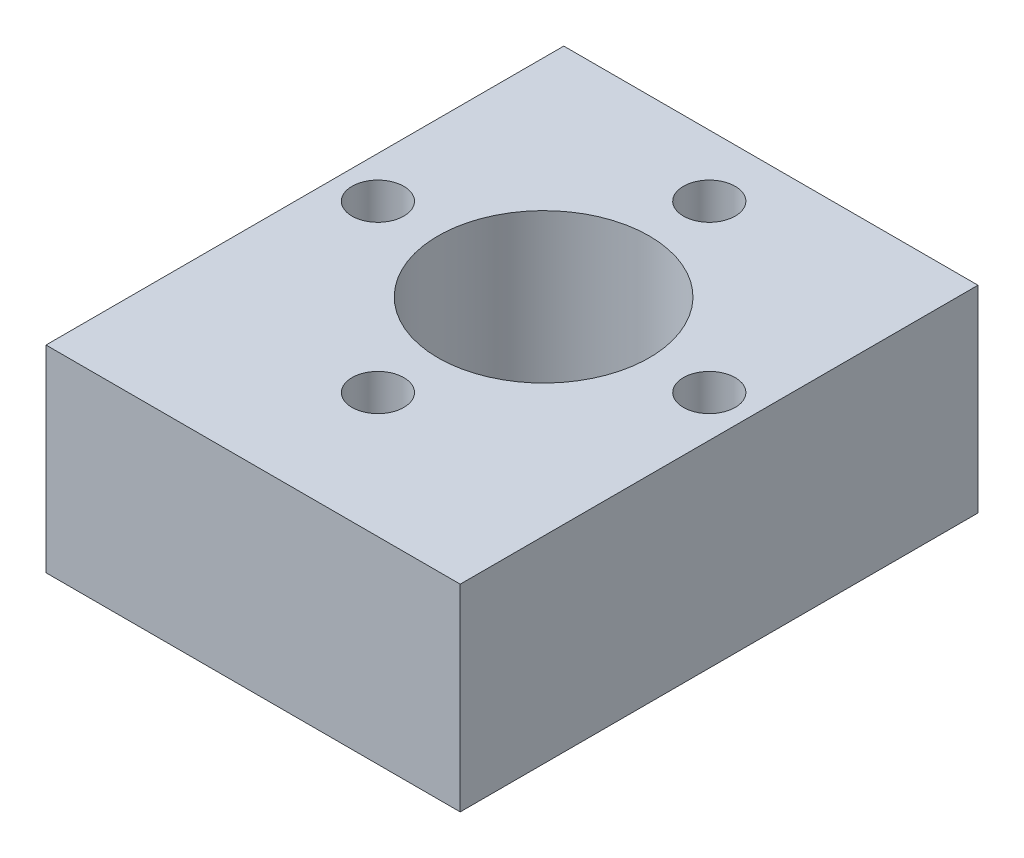
ISO-10303-21;
HEADER;
FILE_DESCRIPTION(('STEP AP214'),'2;1');
FILE_NAME('part.step','',(''),(''),'','','');
FILE_SCHEMA(('AUTOMOTIVE_DESIGN { 1 0 10303 214 1 1 1 1 }'));
ENDSEC;
DATA;
#1=APPLICATION_CONTEXT('core data for automotive mechanical design processes');
#2=APPLICATION_PROTOCOL_DEFINITION('international standard','automotive_design',2000,#1);
#3=PRODUCT_CONTEXT('',#1,'mechanical');
#4=PRODUCT('Part','Part','',(#3));
#5=PRODUCT_RELATED_PRODUCT_CATEGORY('part','',(#4));
#6=PRODUCT_DEFINITION_FORMATION('','',#4);
#7=PRODUCT_DEFINITION_CONTEXT('part definition',#1,'design');
#8=PRODUCT_DEFINITION('design','',#6,#7);
#9=PRODUCT_DEFINITION_SHAPE('','',#8);
#10=(LENGTH_UNIT() NAMED_UNIT(*) SI_UNIT(.MILLI.,.METRE.));
#11=(NAMED_UNIT(*) PLANE_ANGLE_UNIT() SI_UNIT($,.RADIAN.));
#12=(NAMED_UNIT(*) SI_UNIT($,.STERADIAN.) SOLID_ANGLE_UNIT());
#13=UNCERTAINTY_MEASURE_WITH_UNIT(LENGTH_MEASURE(1.E-05),#10,'distance_accuracy_value','');
#14=(GEOMETRIC_REPRESENTATION_CONTEXT(3) GLOBAL_UNCERTAINTY_ASSIGNED_CONTEXT((#13)) GLOBAL_UNIT_ASSIGNED_CONTEXT((#10,
#11,#12)) REPRESENTATION_CONTEXT('',''));
#15=CARTESIAN_POINT('',(0.,0.,0.));
#16=DIRECTION('',(0.,0.,1.));
#17=DIRECTION('',(1.,0.,0.));
#18=AXIS2_PLACEMENT_3D('',#15,#16,#17);
#19=CARTESIAN_POINT('',(0.,9.525,12.5));
#20=DIRECTION('',(0.,0.,-1.));
#21=DIRECTION('',(-1.,0.,0.));
#22=AXIS2_PLACEMENT_3D('',#19,#20,#21);
#23=PLANE('',#22);
#24=DIRECTION('',(1.,0.,0.));
#25=VECTOR('',#24,1.);
#26=CARTESIAN_POINT('',(0.,0.,12.5));
#27=LINE('',#26,#25);
#28=CARTESIAN_POINT('',(-10.,0.,12.5));
#29=VERTEX_POINT('',#28);
#30=CARTESIAN_POINT('',(10.,0.,12.5));
#31=VERTEX_POINT('',#30);
#32=EDGE_CURVE('E177',#29,#31,#27,.T.);
#33=ORIENTED_EDGE('',*,*,#32,.T.);
#34=DIRECTION('',(0.,-1.,0.));
#35=VECTOR('',#34,1.);
#36=CARTESIAN_POINT('',(10.,9.525,12.5));
#37=LINE('',#36,#35);
#38=CARTESIAN_POINT('',(10.,9.525,12.5));
#39=VERTEX_POINT('',#38);
#40=EDGE_CURVE('E11',#39,#31,#37,.T.);
#41=ORIENTED_EDGE('',*,*,#40,.F.);
#42=DIRECTION('',(1.,0.,0.));
#43=VECTOR('',#42,1.);
#44=CARTESIAN_POINT('',(0.,9.525,12.5));
#45=LINE('',#44,#43);
#46=CARTESIAN_POINT('',(-10.,9.525,12.5));
#47=VERTEX_POINT('',#46);
#48=EDGE_CURVE('E161',#47,#39,#45,.T.);
#49=ORIENTED_EDGE('',*,*,#48,.F.);
#50=DIRECTION('',(0.,-1.,0.));
#51=VECTOR('',#50,1.);
#52=CARTESIAN_POINT('',(-10.,9.525,12.5));
#53=LINE('',#52,#51);
#54=EDGE_CURVE('E65',#47,#29,#53,.T.);
#55=ORIENTED_EDGE('',*,*,#54,.T.);
#56=EDGE_LOOP('',(#33,#41,#49,#55));
#57=FACE_BOUND('',#56,.T.);
#58=ADVANCED_FACE('F47',(#57),#23,.F.);
#59=CARTESIAN_POINT('',(10.,9.525,0.));
#60=DIRECTION('',(-1.,0.,0.));
#61=DIRECTION('',(0.,0.,1.));
#62=AXIS2_PLACEMENT_3D('',#59,#60,#61);
#63=PLANE('',#62);
#64=DIRECTION('',(0.,0.,-1.));
#65=VECTOR('',#64,1.);
#66=CARTESIAN_POINT('',(10.,0.,0.));
#67=LINE('',#66,#65);
#68=CARTESIAN_POINT('',(10.,0.,-12.5));
#69=VERTEX_POINT('',#68);
#70=EDGE_CURVE('E180',#31,#69,#67,.T.);
#71=ORIENTED_EDGE('',*,*,#70,.T.);
#72=DIRECTION('',(0.,-1.,0.));
#73=VECTOR('',#72,1.);
#74=CARTESIAN_POINT('',(10.,9.525,-12.5));
#75=LINE('',#74,#73);
#76=CARTESIAN_POINT('',(10.,9.525,-12.5));
#77=VERTEX_POINT('',#76);
#78=EDGE_CURVE('E57',#77,#69,#75,.T.);
#79=ORIENTED_EDGE('',*,*,#78,.F.);
#80=DIRECTION('',(0.,0.,-1.));
#81=VECTOR('',#80,1.);
#82=CARTESIAN_POINT('',(10.,9.525,0.));
#83=LINE('',#82,#81);
#84=EDGE_CURVE('E91',#39,#77,#83,.T.);
#85=ORIENTED_EDGE('',*,*,#84,.F.);
#86=ORIENTED_EDGE('',*,*,#40,.T.);
#87=EDGE_LOOP('',(#71,#79,#85,#86));
#88=FACE_BOUND('',#87,.T.);
#89=ADVANCED_FACE('F198',(#88),#63,.F.);
#90=CARTESIAN_POINT('',(0.,9.525,-12.5));
#91=DIRECTION('',(0.,0.,-1.));
#92=DIRECTION('',(-1.,0.,0.));
#93=AXIS2_PLACEMENT_3D('',#90,#91,#92);
#94=PLANE('',#93);
#95=CARTESIAN_POINT('',(7.,4.7625,-12.5));
#96=DIRECTION('',(0.,0.,-1.));
#97=DIRECTION('',(-1.,0.,0.));
#98=AXIS2_PLACEMENT_3D('',#95,#96,#97);
#99=CIRCLE('',#98,1.24999999999999);
#100=CARTESIAN_POINT('',(5.75000000000001,4.7625,-12.5));
#101=VERTEX_POINT('',#100);
#102=EDGE_CURVE('E111',#101,#101,#99,.T.);
#103=ORIENTED_EDGE('',*,*,#102,.F.);
#104=EDGE_LOOP('',(#103));
#105=FACE_BOUND('',#104,.T.);
#106=CARTESIAN_POINT('',(-7.,4.7625,-12.5));
#107=DIRECTION('',(0.,0.,-1.));
#108=DIRECTION('',(-1.,0.,0.));
#109=AXIS2_PLACEMENT_3D('',#106,#107,#108);
#110=CIRCLE('',#109,1.24999999999999);
#111=CARTESIAN_POINT('',(-8.24999999999999,4.7625,-12.5));
#112=VERTEX_POINT('',#111);
#113=EDGE_CURVE('E110',#112,#112,#110,.T.);
#114=ORIENTED_EDGE('',*,*,#113,.F.);
#115=EDGE_LOOP('',(#114));
#116=FACE_BOUND('',#115,.T.);
#117=DIRECTION('',(1.,0.,0.));
#118=VECTOR('',#117,1.);
#119=CARTESIAN_POINT('',(0.,0.,-12.5));
#120=LINE('',#119,#118);
#121=CARTESIAN_POINT('',(-10.,0.,-12.5));
#122=VERTEX_POINT('',#121);
#123=EDGE_CURVE('E184',#122,#69,#120,.T.);
#124=ORIENTED_EDGE('',*,*,#123,.F.);
#125=DIRECTION('',(0.,-1.,0.));
#126=VECTOR('',#125,1.);
#127=CARTESIAN_POINT('',(-10.,9.525,-12.5));
#128=LINE('',#127,#126);
#129=CARTESIAN_POINT('',(-10.,9.525,-12.5));
#130=VERTEX_POINT('',#129);
#131=EDGE_CURVE('E80',#130,#122,#128,.T.);
#132=ORIENTED_EDGE('',*,*,#131,.F.);
#133=DIRECTION('',(1.,0.,0.));
#134=VECTOR('',#133,1.);
#135=CARTESIAN_POINT('',(0.,9.525,-12.5));
#136=LINE('',#135,#134);
#137=EDGE_CURVE('E167',#130,#77,#136,.T.);
#138=ORIENTED_EDGE('',*,*,#137,.T.);
#139=ORIENTED_EDGE('',*,*,#78,.T.);
#140=EDGE_LOOP('',(#124,#132,#138,#139));
#141=FACE_BOUND('',#140,.T.);
#142=ADVANCED_FACE('F196',(#105,#116,#141),#94,.T.);
#143=CARTESIAN_POINT('',(0.,9.525,-1.5261946));
#144=DIRECTION('',(0.,-1.,0.));
#145=DIRECTION('',(0.,0.,-1.));
#146=AXIS2_PLACEMENT_3D('',#143,#144,#145);
#147=CYLINDRICAL_SURFACE('',#146,5.1);
#148=CARTESIAN_POINT('',(0.,9.525,-1.5261946));
#149=DIRECTION('',(0.,1.,0.));
#150=DIRECTION('',(0.,0.,1.));
#151=AXIS2_PLACEMENT_3D('',#148,#149,#150);
#152=CIRCLE('',#151,5.1);
#153=CARTESIAN_POINT('',(0.,9.525,-6.6261946));
#154=VERTEX_POINT('',#153);
#155=EDGE_CURVE('E157',#154,#154,#152,.T.);
#156=CARTESIAN_POINT('',(0.,0.,-1.5261946));
#157=DIRECTION('',(0.,1.,0.));
#158=DIRECTION('',(0.,0.,1.));
#159=AXIS2_PLACEMENT_3D('',#156,#157,#158);
#160=CIRCLE('',#159,5.1);
#161=CARTESIAN_POINT('',(0.,0.,-6.6261946));
#162=VERTEX_POINT('',#161);
#163=EDGE_CURVE('E156',#162,#162,#160,.T.);
#164=CARTESIAN_POINT('',(0.,9.525,-6.6261946));
#165=CARTESIAN_POINT('',(0.,9.42578125,-6.6261946));
#166=CARTESIAN_POINT('',(0.,9.3265625,-6.6261946));
#167=CARTESIAN_POINT('',(0.,9.128125,-6.6261946));
#168=CARTESIAN_POINT('',(0.,9.02890625,-6.6261946));
#169=CARTESIAN_POINT('',(0.,8.83046875,-6.6261946));
#170=CARTESIAN_POINT('',(0.,8.73125,-6.6261946));
#171=CARTESIAN_POINT('',(0.,8.5328125,-6.6261946));
#172=CARTESIAN_POINT('',(0.,8.43359375,-6.6261946));
#173=CARTESIAN_POINT('',(0.,8.23515625,-6.6261946));
#174=CARTESIAN_POINT('',(0.,8.1359375,-6.6261946));
#175=CARTESIAN_POINT('',(0.,7.9375,-6.6261946));
#176=CARTESIAN_POINT('',(0.,7.83828125,-6.6261946));
#177=CARTESIAN_POINT('',(0.,7.63984375,-6.6261946));
#178=CARTESIAN_POINT('',(0.,7.540625,-6.6261946));
#179=CARTESIAN_POINT('',(0.,7.3421875,-6.6261946));
#180=CARTESIAN_POINT('',(0.,7.24296875,-6.6261946));
#181=CARTESIAN_POINT('',(0.,7.04453125,-6.6261946));
#182=CARTESIAN_POINT('',(0.,6.9453125,-6.6261946));
#183=CARTESIAN_POINT('',(0.,6.746875,-6.6261946));
#184=CARTESIAN_POINT('',(0.,6.64765625,-6.6261946));
#185=CARTESIAN_POINT('',(0.,6.44921875,-6.6261946));
#186=CARTESIAN_POINT('',(0.,6.35,-6.6261946));
#187=CARTESIAN_POINT('',(0.,6.1515625,-6.6261946));
#188=CARTESIAN_POINT('',(0.,6.05234375,-6.6261946));
#189=CARTESIAN_POINT('',(0.,5.85390625,-6.6261946));
#190=CARTESIAN_POINT('',(0.,5.7546875,-6.6261946));
#191=CARTESIAN_POINT('',(0.,5.55625,-6.6261946));
#192=CARTESIAN_POINT('',(0.,5.45703125,-6.6261946));
#193=CARTESIAN_POINT('',(0.,5.25859375,-6.6261946));
#194=CARTESIAN_POINT('',(0.,5.159375,-6.6261946));
#195=CARTESIAN_POINT('',(0.,4.9609375,-6.6261946));
#196=CARTESIAN_POINT('',(0.,4.86171875,-6.6261946));
#197=CARTESIAN_POINT('',(0.,4.66328125,-6.6261946));
#198=CARTESIAN_POINT('',(0.,4.5640625,-6.6261946));
#199=CARTESIAN_POINT('',(0.,4.365625,-6.6261946));
#200=CARTESIAN_POINT('',(0.,4.26640625,-6.6261946));
#201=CARTESIAN_POINT('',(0.,4.06796875,-6.6261946));
#202=CARTESIAN_POINT('',(0.,3.96875,-6.6261946));
#203=CARTESIAN_POINT('',(0.,3.7703125,-6.6261946));
#204=CARTESIAN_POINT('',(0.,3.67109375,-6.6261946));
#205=CARTESIAN_POINT('',(0.,3.47265625,-6.6261946));
#206=CARTESIAN_POINT('',(0.,3.3734375,-6.6261946));
#207=CARTESIAN_POINT('',(0.,3.175,-6.6261946));
#208=CARTESIAN_POINT('',(0.,3.07578125,-6.6261946));
#209=CARTESIAN_POINT('',(0.,2.87734375,-6.6261946));
#210=CARTESIAN_POINT('',(0.,2.778125,-6.6261946));
#211=CARTESIAN_POINT('',(0.,2.5796875,-6.6261946));
#212=CARTESIAN_POINT('',(0.,2.48046875,-6.6261946));
#213=CARTESIAN_POINT('',(0.,2.28203125,-6.6261946));
#214=CARTESIAN_POINT('',(0.,2.1828125,-6.6261946));
#215=CARTESIAN_POINT('',(0.,1.984375,-6.6261946));
#216=CARTESIAN_POINT('',(0.,1.88515625,-6.6261946));
#217=CARTESIAN_POINT('',(0.,1.68671875,-6.6261946));
#218=CARTESIAN_POINT('',(0.,1.5875,-6.6261946));
#219=CARTESIAN_POINT('',(0.,1.3890625,-6.6261946));
#220=CARTESIAN_POINT('',(0.,1.28984375,-6.6261946));
#221=CARTESIAN_POINT('',(0.,1.09140625,-6.6261946));
#222=CARTESIAN_POINT('',(0.,0.992187500000001,-6.6261946));
#223=CARTESIAN_POINT('',(0.,0.793750000000001,-6.6261946));
#224=CARTESIAN_POINT('',(0.,0.69453125,-6.6261946));
#225=CARTESIAN_POINT('',(0.,0.49609375,-6.6261946));
#226=CARTESIAN_POINT('',(0.,0.396875,-6.6261946));
#227=CARTESIAN_POINT('',(0.,0.1984375,-6.6261946));
#228=CARTESIAN_POINT('',(0.,0.0992187500000001,-6.6261946));
#229=CARTESIAN_POINT('',(0.,0.,-6.6261946));
#230=B_SPLINE_CURVE_WITH_KNOTS('',3,(#164,#165,#166,#167,#168,#169,#170,#171,#172,#173,#174,
#175,#176,#177,#178,#179,#180,#181,#182,#183,#184,#185,#186,#187,#188,#189,#190,#191,#192,#193,
#194,#195,#196,#197,#198,#199,#200,#201,#202,#203,#204,#205,#206,#207,#208,#209,#210,#211,#212,
#213,#214,#215,#216,#217,#218,#219,#220,#221,#222,#223,#224,#225,#226,#227,#228,#229),
.UNSPECIFIED.,.F.,.F.,(4,2,2,2,2,2,2,2,2,2,2,2,2,2,2,2,2,2,2,2,2,2,2,2,2,2,2,2,2,2,2,2,4),(0.,
0.297656249999998,0.595312499999999,0.892968749999999,1.190625,1.48828125,1.7859375,2.08359375,
2.38125,2.67890625,2.9765625,3.27421875,3.571875,3.86953125,4.1671875,4.46484375,4.7625,
5.06015625,5.3578125,5.65546875,5.953125,6.25078125,6.5484375,6.84609375,7.14375,7.44140625,
7.7390625,8.03671875,8.334375,8.63203125,8.9296875,9.22734375,9.525),.UNSPECIFIED.);
#231=EDGE_CURVE('BSEAM49',#154,#162,#230,.T.);
#232=ORIENTED_EDGE('',*,*,#155,.T.);
#233=ORIENTED_EDGE('',*,*,#163,.F.);
#234=ORIENTED_EDGE('',*,*,#231,.T.);
#235=ORIENTED_EDGE('',*,*,#231,.F.);
#236=EDGE_LOOP('',(#232,#234,#233,#235));
#237=FACE_BOUND('',#236,.T.);
#238=ADVANCED_FACE('F49',(#237),#147,.F.);
#239=CARTESIAN_POINT('',(-10.,9.525,0.));
#240=DIRECTION('',(-1.,0.,0.));
#241=DIRECTION('',(0.,0.,1.));
#242=AXIS2_PLACEMENT_3D('',#239,#240,#241);
#243=PLANE('',#242);
#244=DIRECTION('',(0.,0.,-1.));
#245=VECTOR('',#244,1.);
#246=CARTESIAN_POINT('',(-10.,0.,0.));
#247=LINE('',#246,#245);
#248=EDGE_CURVE('E162',#29,#122,#247,.T.);
#249=ORIENTED_EDGE('',*,*,#248,.F.);
#250=ORIENTED_EDGE('',*,*,#54,.F.);
#251=DIRECTION('',(0.,0.,-1.));
#252=VECTOR('',#251,1.);
#253=CARTESIAN_POINT('',(-10.,9.525,0.));
#254=LINE('',#253,#252);
#255=EDGE_CURVE('E171',#47,#130,#254,.T.);
#256=ORIENTED_EDGE('',*,*,#255,.T.);
#257=ORIENTED_EDGE('',*,*,#131,.T.);
#258=EDGE_LOOP('',(#249,#250,#256,#257));
#259=FACE_BOUND('',#258,.T.);
#260=ADVANCED_FACE('F202',(#259),#243,.T.);
#261=CARTESIAN_POINT('',(0.,9.525,0.));
#262=DIRECTION('',(0.,1.,0.));
#263=DIRECTION('',(0.,0.,1.));
#264=AXIS2_PLACEMENT_3D('',#261,#262,#263);
#265=PLANE('',#264);
#266=CARTESIAN_POINT('',(0.,9.525,-9.5261946));
#267=DIRECTION('',(0.,1.,0.));
#268=DIRECTION('',(0.,0.,1.));
#269=AXIS2_PLACEMENT_3D('',#266,#267,#268);
#270=CIRCLE('',#269,1.25);
#271=CARTESIAN_POINT('',(0.,9.525,-8.2761946));
#272=VERTEX_POINT('',#271);
#273=EDGE_CURVE('E124',#272,#272,#270,.T.);
#274=ORIENTED_EDGE('',*,*,#273,.F.);
#275=EDGE_LOOP('',(#274));
#276=FACE_BOUND('',#275,.T.);
#277=CARTESIAN_POINT('',(8.,9.525,-1.5261946));
#278=DIRECTION('',(0.,1.,0.));
#279=DIRECTION('',(0.,0.,1.));
#280=AXIS2_PLACEMENT_3D('',#277,#278,#279);
#281=CIRCLE('',#280,1.25);
#282=CARTESIAN_POINT('',(8.,9.525,-0.276194600000001));
#283=VERTEX_POINT('',#282);
#284=EDGE_CURVE('E132',#283,#283,#281,.T.);
#285=ORIENTED_EDGE('',*,*,#284,.F.);
#286=EDGE_LOOP('',(#285));
#287=FACE_BOUND('',#286,.T.);
#288=CARTESIAN_POINT('',(0.,9.525,6.4738054));
#289=DIRECTION('',(0.,1.,0.));
#290=DIRECTION('',(0.,0.,1.));
#291=AXIS2_PLACEMENT_3D('',#288,#289,#290);
#292=CIRCLE('',#291,1.25);
#293=CARTESIAN_POINT('',(0.,9.525,7.7238054));
#294=VERTEX_POINT('',#293);
#295=EDGE_CURVE('E140',#294,#294,#292,.T.);
#296=ORIENTED_EDGE('',*,*,#295,.F.);
#297=EDGE_LOOP('',(#296));
#298=FACE_BOUND('',#297,.T.);
#299=CARTESIAN_POINT('',(-8.,9.525,-1.5261946));
#300=DIRECTION('',(0.,1.,0.));
#301=DIRECTION('',(0.,0.,1.));
#302=AXIS2_PLACEMENT_3D('',#299,#300,#301);
#303=CIRCLE('',#302,1.25);
#304=CARTESIAN_POINT('',(-8.,9.525,-0.276194600000001));
#305=VERTEX_POINT('',#304);
#306=EDGE_CURVE('E148',#305,#305,#303,.T.);
#307=ORIENTED_EDGE('',*,*,#306,.F.);
#308=EDGE_LOOP('',(#307));
#309=FACE_BOUND('',#308,.T.);
#310=ORIENTED_EDGE('',*,*,#155,.F.);
#311=EDGE_LOOP('',(#310));
#312=FACE_BOUND('',#311,.T.);
#313=ORIENTED_EDGE('',*,*,#48,.T.);
#314=ORIENTED_EDGE('',*,*,#84,.T.);
#315=ORIENTED_EDGE('',*,*,#137,.F.);
#316=ORIENTED_EDGE('',*,*,#255,.F.);
#317=EDGE_LOOP('',(#313,#314,#315,#316));
#318=FACE_BOUND('',#317,.T.);
#319=ADVANCED_FACE('F204',(#276,#287,#298,#309,#312,#318),#265,.T.);
#320=CARTESIAN_POINT('',(0.,0.,0.));
#321=DIRECTION('',(0.,1.,0.));
#322=DIRECTION('',(0.,0.,1.));
#323=AXIS2_PLACEMENT_3D('',#320,#321,#322);
#324=PLANE('',#323);
#325=CARTESIAN_POINT('',(0.,0.,-9.5261946));
#326=DIRECTION('',(0.,1.,0.));
#327=DIRECTION('',(0.,0.,1.));
#328=AXIS2_PLACEMENT_3D('',#325,#326,#327);
#329=CIRCLE('',#328,1.25);
#330=CARTESIAN_POINT('',(0.,0.,-8.2761946));
#331=VERTEX_POINT('',#330);
#332=EDGE_CURVE('E128',#331,#331,#329,.T.);
#333=ORIENTED_EDGE('',*,*,#332,.T.);
#334=EDGE_LOOP('',(#333));
#335=FACE_BOUND('',#334,.T.);
#336=CARTESIAN_POINT('',(8.,0.,-1.5261946));
#337=DIRECTION('',(0.,1.,0.));
#338=DIRECTION('',(0.,0.,1.));
#339=AXIS2_PLACEMENT_3D('',#336,#337,#338);
#340=CIRCLE('',#339,1.25);
#341=CARTESIAN_POINT('',(8.,0.,-0.276194600000002));
#342=VERTEX_POINT('',#341);
#343=EDGE_CURVE('E136',#342,#342,#340,.T.);
#344=ORIENTED_EDGE('',*,*,#343,.T.);
#345=EDGE_LOOP('',(#344));
#346=FACE_BOUND('',#345,.T.);
#347=CARTESIAN_POINT('',(0.,0.,6.4738054));
#348=DIRECTION('',(0.,1.,0.));
#349=DIRECTION('',(0.,0.,1.));
#350=AXIS2_PLACEMENT_3D('',#347,#348,#349);
#351=CIRCLE('',#350,1.25);
#352=CARTESIAN_POINT('',(0.,0.,7.7238054));
#353=VERTEX_POINT('',#352);
#354=EDGE_CURVE('E144',#353,#353,#351,.T.);
#355=ORIENTED_EDGE('',*,*,#354,.T.);
#356=EDGE_LOOP('',(#355));
#357=FACE_BOUND('',#356,.T.);
#358=CARTESIAN_POINT('',(-8.,0.,-1.5261946));
#359=DIRECTION('',(0.,1.,0.));
#360=DIRECTION('',(0.,0.,1.));
#361=AXIS2_PLACEMENT_3D('',#358,#359,#360);
#362=CIRCLE('',#361,1.25);
#363=CARTESIAN_POINT('',(-8.,0.,-0.276194600000002));
#364=VERTEX_POINT('',#363);
#365=EDGE_CURVE('E152',#364,#364,#362,.T.);
#366=ORIENTED_EDGE('',*,*,#365,.T.);
#367=EDGE_LOOP('',(#366));
#368=FACE_BOUND('',#367,.T.);
#369=ORIENTED_EDGE('',*,*,#163,.T.);
#370=EDGE_LOOP('',(#369));
#371=FACE_BOUND('',#370,.T.);
#372=ORIENTED_EDGE('',*,*,#32,.F.);
#373=ORIENTED_EDGE('',*,*,#248,.T.);
#374=ORIENTED_EDGE('',*,*,#123,.T.);
#375=ORIENTED_EDGE('',*,*,#70,.F.);
#376=EDGE_LOOP('',(#372,#373,#374,#375));
#377=FACE_BOUND('',#376,.T.);
#378=ADVANCED_FACE('F201',(#335,#346,#357,#368,#371,#377),#324,.F.);
#379=CARTESIAN_POINT('',(-8.,9.525,-1.5261946));
#380=DIRECTION('',(0.,1.,0.));
#381=DIRECTION('',(0.,0.,1.));
#382=AXIS2_PLACEMENT_3D('',#379,#380,#381);
#383=CYLINDRICAL_SURFACE('',#382,1.25);
#384=ORIENTED_EDGE('',*,*,#365,.F.);
#385=EDGE_LOOP('',(#384));
#386=FACE_BOUND('',#385,.T.);
#387=ORIENTED_EDGE('',*,*,#306,.T.);
#388=EDGE_LOOP('',(#387));
#389=FACE_BOUND('',#388,.T.);
#390=ADVANCED_FACE('F251',(#386,#389),#383,.F.);
#391=CARTESIAN_POINT('',(0.,9.525,6.4738054));
#392=DIRECTION('',(0.,1.,0.));
#393=DIRECTION('',(0.,0.,1.));
#394=AXIS2_PLACEMENT_3D('',#391,#392,#393);
#395=CYLINDRICAL_SURFACE('',#394,1.25);
#396=ORIENTED_EDGE('',*,*,#354,.F.);
#397=EDGE_LOOP('',(#396));
#398=FACE_BOUND('',#397,.T.);
#399=ORIENTED_EDGE('',*,*,#295,.T.);
#400=EDGE_LOOP('',(#399));
#401=FACE_BOUND('',#400,.T.);
#402=ADVANCED_FACE('F247',(#398,#401),#395,.F.);
#403=CARTESIAN_POINT('',(8.,9.525,-1.5261946));
#404=DIRECTION('',(0.,1.,0.));
#405=DIRECTION('',(0.,0.,1.));
#406=AXIS2_PLACEMENT_3D('',#403,#404,#405);
#407=CYLINDRICAL_SURFACE('',#406,1.25);
#408=ORIENTED_EDGE('',*,*,#343,.F.);
#409=EDGE_LOOP('',(#408));
#410=FACE_BOUND('',#409,.T.);
#411=ORIENTED_EDGE('',*,*,#284,.T.);
#412=EDGE_LOOP('',(#411));
#413=FACE_BOUND('',#412,.T.);
#414=ADVANCED_FACE('F243',(#410,#413),#407,.F.);
#415=CARTESIAN_POINT('',(0.,9.525,-9.5261946));
#416=DIRECTION('',(0.,1.,0.));
#417=DIRECTION('',(0.,0.,1.));
#418=AXIS2_PLACEMENT_3D('',#415,#416,#417);
#419=CYLINDRICAL_SURFACE('',#418,1.25);
#420=ORIENTED_EDGE('',*,*,#332,.F.);
#421=EDGE_LOOP('',(#420));
#422=FACE_BOUND('',#421,.T.);
#423=ORIENTED_EDGE('',*,*,#273,.T.);
#424=EDGE_LOOP('',(#423));
#425=FACE_BOUND('',#424,.T.);
#426=ADVANCED_FACE('F236',(#422,#425),#419,.F.);
#427=CARTESIAN_POINT('',(-7.,4.7625,-6.5));
#428=DIRECTION('',(0.,0.,-1.));
#429=DIRECTION('',(-1.,0.,0.));
#430=AXIS2_PLACEMENT_3D('',#427,#428,#429);
#431=CONICAL_SURFACE('',#430,1.25,1.02974425867665);
#432=CARTESIAN_POINT('',(-7.,4.7625,-5.74892422621555));
#433=VERTEX_POINT('',#432);
#434=VERTEX_LOOP('',#433);
#435=FACE_BOUND('',#434,.T.);
#436=CARTESIAN_POINT('',(-7.,4.7625,-6.5));
#437=DIRECTION('',(0.,0.,-1.));
#438=DIRECTION('',(-1.,0.,0.));
#439=AXIS2_PLACEMENT_3D('',#436,#437,#438);
#440=CIRCLE('',#439,1.25);
#441=CARTESIAN_POINT('',(-8.25,4.7625,-6.5));
#442=VERTEX_POINT('',#441);
#443=EDGE_CURVE('E116',#442,#442,#440,.T.);
#444=ORIENTED_EDGE('',*,*,#443,.T.);
#445=EDGE_LOOP('',(#444));
#446=FACE_BOUND('',#445,.T.);
#447=ADVANCED_FACE('F231',(#435,#446),#431,.F.);
#448=CARTESIAN_POINT('',(-7.,4.7625,-12.5));
#449=DIRECTION('',(0.,0.,-1.));
#450=DIRECTION('',(-1.,0.,0.));
#451=AXIS2_PLACEMENT_3D('',#448,#449,#450);
#452=CYLINDRICAL_SURFACE('',#451,1.24999999999999);
#453=ORIENTED_EDGE('',*,*,#443,.F.);
#454=EDGE_LOOP('',(#453));
#455=FACE_BOUND('',#454,.T.);
#456=ORIENTED_EDGE('',*,*,#113,.T.);
#457=EDGE_LOOP('',(#456));
#458=FACE_BOUND('',#457,.T.);
#459=ADVANCED_FACE('F103',(#455,#458),#452,.F.);
#460=CARTESIAN_POINT('',(7.,4.7625,-6.5));
#461=DIRECTION('',(0.,0.,-1.));
#462=DIRECTION('',(-1.,0.,0.));
#463=AXIS2_PLACEMENT_3D('',#460,#461,#462);
#464=CONICAL_SURFACE('',#463,1.25,1.02974425867665);
#465=CARTESIAN_POINT('',(7.,4.7625,-5.74892422621555));
#466=VERTEX_POINT('',#465);
#467=VERTEX_LOOP('',#466);
#468=FACE_BOUND('',#467,.T.);
#469=CARTESIAN_POINT('',(7.,4.7625,-6.5));
#470=DIRECTION('',(0.,0.,-1.));
#471=DIRECTION('',(-1.,0.,0.));
#472=AXIS2_PLACEMENT_3D('',#469,#470,#471);
#473=CIRCLE('',#472,1.25);
#474=CARTESIAN_POINT('',(5.75,4.7625,-6.5));
#475=VERTEX_POINT('',#474);
#476=EDGE_CURVE('E107',#475,#475,#473,.T.);
#477=ORIENTED_EDGE('',*,*,#476,.T.);
#478=EDGE_LOOP('',(#477));
#479=FACE_BOUND('',#478,.T.);
#480=ADVANCED_FACE('F99',(#468,#479),#464,.F.);
#481=CARTESIAN_POINT('',(7.,4.7625,-12.5));
#482=DIRECTION('',(0.,0.,-1.));
#483=DIRECTION('',(-1.,0.,0.));
#484=AXIS2_PLACEMENT_3D('',#481,#482,#483);
#485=CYLINDRICAL_SURFACE('',#484,1.24999999999999);
#486=ORIENTED_EDGE('',*,*,#476,.F.);
#487=EDGE_LOOP('',(#486));
#488=FACE_BOUND('',#487,.T.);
#489=ORIENTED_EDGE('',*,*,#102,.T.);
#490=EDGE_LOOP('',(#489));
#491=FACE_BOUND('',#490,.T.);
#492=ADVANCED_FACE('F102',(#488,#491),#485,.F.);
#493=CLOSED_SHELL('',(#58,#89,#142,#238,#260,#319,#378,#390,#402,#414,#426,#447,#459,#480,#492));
#494=MANIFOLD_SOLID_BREP('B2',#493);
#495=ADVANCED_BREP_SHAPE_REPRESENTATION('',(#18,#494),#14);
#496=SHAPE_DEFINITION_REPRESENTATION(#9,#495);
ENDSEC;
END-ISO-10303-21;
